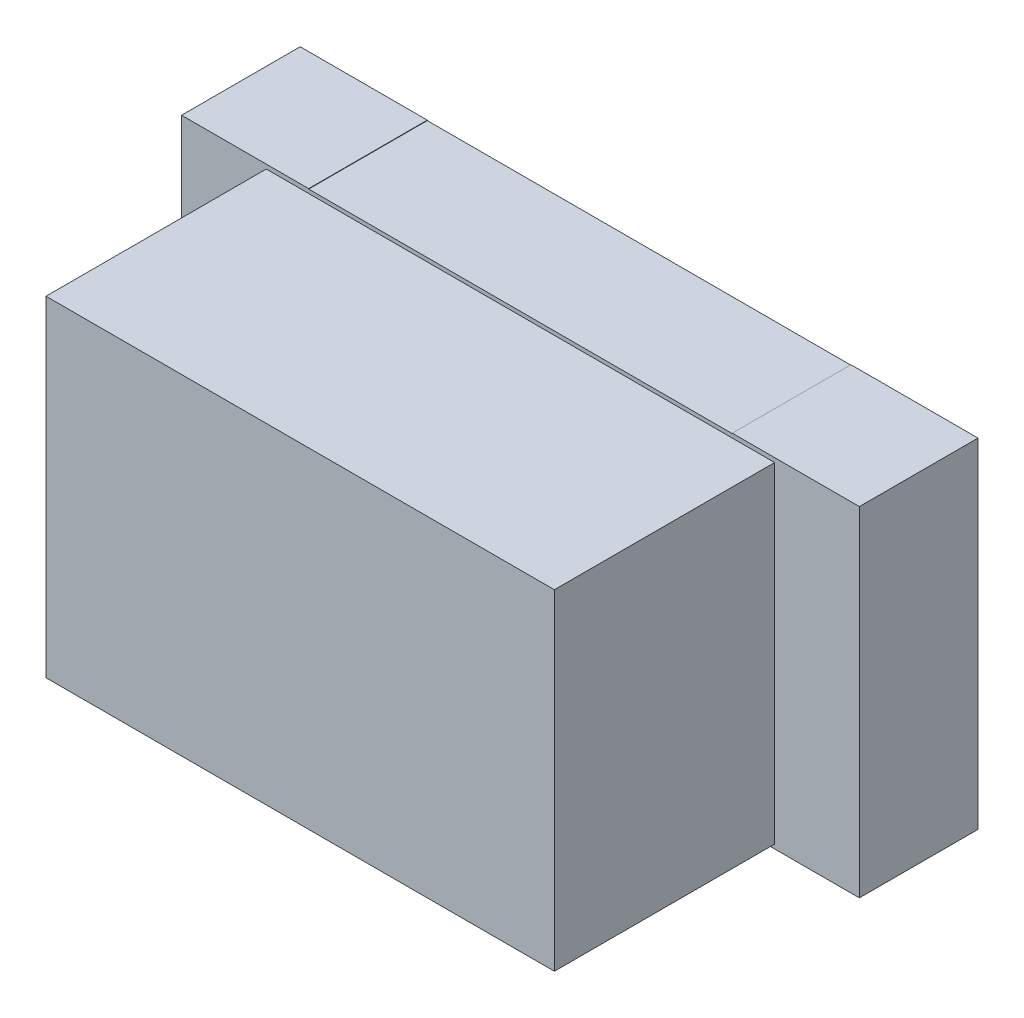
ISO-10303-21;
HEADER;
FILE_DESCRIPTION(('STEP AP214'),'2;1');
FILE_NAME('part.step','',(''),(''),'','','');
FILE_SCHEMA(('AUTOMOTIVE_DESIGN { 1 0 10303 214 1 1 1 1 }'));
ENDSEC;
DATA;
#1=APPLICATION_CONTEXT('core data for automotive mechanical design processes');
#2=APPLICATION_PROTOCOL_DEFINITION('international standard','automotive_design',2000,#1);
#3=PRODUCT_CONTEXT('',#1,'mechanical');
#4=PRODUCT('Part','Part','',(#3));
#5=PRODUCT_RELATED_PRODUCT_CATEGORY('part','',(#4));
#6=PRODUCT_DEFINITION_FORMATION('','',#4);
#7=PRODUCT_DEFINITION_CONTEXT('part definition',#1,'design');
#8=PRODUCT_DEFINITION('design','',#6,#7);
#9=PRODUCT_DEFINITION_SHAPE('','',#8);
#10=(LENGTH_UNIT() NAMED_UNIT(*) SI_UNIT(.MILLI.,.METRE.));
#11=(NAMED_UNIT(*) PLANE_ANGLE_UNIT() SI_UNIT($,.RADIAN.));
#12=(NAMED_UNIT(*) SI_UNIT($,.STERADIAN.) SOLID_ANGLE_UNIT());
#13=UNCERTAINTY_MEASURE_WITH_UNIT(LENGTH_MEASURE(1.E-05),#10,'distance_accuracy_value','');
#14=(GEOMETRIC_REPRESENTATION_CONTEXT(3) GLOBAL_UNCERTAINTY_ASSIGNED_CONTEXT((#13)) GLOBAL_UNIT_ASSIGNED_CONTEXT((#10,
#11,#12)) REPRESENTATION_CONTEXT('',''));
#15=CARTESIAN_POINT('',(0.,0.,0.));
#16=DIRECTION('',(0.,0.,1.));
#17=DIRECTION('',(1.,0.,0.));
#18=AXIS2_PLACEMENT_3D('',#15,#16,#17);
#19=CARTESIAN_POINT('',(0.,0.,0.));
#20=DIRECTION('',(0.,0.,1.));
#21=DIRECTION('',(1.,0.,0.));
#22=AXIS2_PLACEMENT_3D('',#19,#20,#21);
#23=PLANE('',#22);
#24=DIRECTION('',(0.,1.,0.));
#25=VECTOR('',#24,1.);
#26=CARTESIAN_POINT('',(-0.5,0.,0.));
#27=LINE('',#26,#25);
#28=CARTESIAN_POINT('',(-0.5,0.4,0.));
#29=VERTEX_POINT('',#28);
#30=CARTESIAN_POINT('',(-0.5,0.399,0.));
#31=VERTEX_POINT('',#30);
#32=EDGE_CURVE('E211',#29,#31,#27,.F.);
#33=ORIENTED_EDGE('',*,*,#32,.T.);
#34=DIRECTION('',(1.,0.,0.));
#35=VECTOR('',#34,1.);
#36=CARTESIAN_POINT('',(0.5,0.399,0.));
#37=LINE('',#36,#35);
#38=CARTESIAN_POINT('',(0.5,0.399,0.));
#39=VERTEX_POINT('',#38);
#40=EDGE_CURVE('E177',#31,#39,#37,.T.);
#41=ORIENTED_EDGE('',*,*,#40,.T.);
#42=DIRECTION('',(0.,1.,0.));
#43=VECTOR('',#42,1.);
#44=CARTESIAN_POINT('',(0.5,0.,0.));
#45=LINE('',#44,#43);
#46=CARTESIAN_POINT('',(0.5,0.4,0.));
#47=VERTEX_POINT('',#46);
#48=EDGE_CURVE('E185',#39,#47,#45,.T.);
#49=ORIENTED_EDGE('',*,*,#48,.T.);
#50=DIRECTION('',(1.,0.,0.));
#51=VECTOR('',#50,1.);
#52=CARTESIAN_POINT('',(-0.8,0.4,0.));
#53=LINE('',#52,#51);
#54=CARTESIAN_POINT('',(0.8,0.4,0.));
#55=VERTEX_POINT('',#54);
#56=EDGE_CURVE('E183',#47,#55,#53,.T.);
#57=ORIENTED_EDGE('',*,*,#56,.T.);
#58=DIRECTION('',(0.,-1.,0.));
#59=VECTOR('',#58,1.);
#60=CARTESIAN_POINT('',(0.8,0.4,0.));
#61=LINE('',#60,#59);
#62=CARTESIAN_POINT('',(0.8,-0.4,0.));
#63=VERTEX_POINT('',#62);
#64=EDGE_CURVE('E132',#55,#63,#61,.T.);
#65=ORIENTED_EDGE('',*,*,#64,.T.);
#66=DIRECTION('',(1.,0.,0.));
#67=VECTOR('',#66,1.);
#68=CARTESIAN_POINT('',(-0.8,-0.4,0.));
#69=LINE('',#68,#67);
#70=CARTESIAN_POINT('',(0.5,-0.4,0.));
#71=VERTEX_POINT('',#70);
#72=EDGE_CURVE('E127',#63,#71,#69,.F.);
#73=ORIENTED_EDGE('',*,*,#72,.T.);
#74=DIRECTION('',(0.,1.,0.));
#75=VECTOR('',#74,1.);
#76=CARTESIAN_POINT('',(0.5,0.,0.));
#77=LINE('',#76,#75);
#78=CARTESIAN_POINT('',(0.5,-0.399,0.));
#79=VERTEX_POINT('',#78);
#80=EDGE_CURVE('E20',#71,#79,#77,.T.);
#81=ORIENTED_EDGE('',*,*,#80,.T.);
#82=DIRECTION('',(1.,0.,0.));
#83=VECTOR('',#82,1.);
#84=CARTESIAN_POINT('',(0.5,-0.399,0.));
#85=LINE('',#84,#83);
#86=CARTESIAN_POINT('',(-0.5,-0.399,0.));
#87=VERTEX_POINT('',#86);
#88=EDGE_CURVE('E154',#79,#87,#85,.F.);
#89=ORIENTED_EDGE('',*,*,#88,.T.);
#90=DIRECTION('',(0.,1.,0.));
#91=VECTOR('',#90,1.);
#92=CARTESIAN_POINT('',(-0.5,0.,0.));
#93=LINE('',#92,#91);
#94=CARTESIAN_POINT('',(-0.5,-0.4,0.));
#95=VERTEX_POINT('',#94);
#96=EDGE_CURVE('E162',#87,#95,#93,.F.);
#97=ORIENTED_EDGE('',*,*,#96,.T.);
#98=DIRECTION('',(1.,0.,0.));
#99=VECTOR('',#98,1.);
#100=CARTESIAN_POINT('',(-0.8,-0.4,0.));
#101=LINE('',#100,#99);
#102=CARTESIAN_POINT('',(-0.8,-0.4,0.));
#103=VERTEX_POINT('',#102);
#104=EDGE_CURVE('E159',#95,#103,#101,.F.);
#105=ORIENTED_EDGE('',*,*,#104,.T.);
#106=DIRECTION('',(0.,1.,0.));
#107=VECTOR('',#106,1.);
#108=CARTESIAN_POINT('',(-0.8,0.4,0.));
#109=LINE('',#108,#107);
#110=CARTESIAN_POINT('',(-0.8,0.4,0.));
#111=VERTEX_POINT('',#110);
#112=EDGE_CURVE('E166',#103,#111,#109,.T.);
#113=ORIENTED_EDGE('',*,*,#112,.T.);
#114=DIRECTION('',(1.,0.,0.));
#115=VECTOR('',#114,1.);
#116=CARTESIAN_POINT('',(-0.8,0.4,0.));
#117=LINE('',#116,#115);
#118=EDGE_CURVE('E172',#111,#29,#117,.T.);
#119=ORIENTED_EDGE('',*,*,#118,.T.);
#120=EDGE_LOOP('',(#33,#41,#49,#57,#65,#73,#81,#89,#97,#105,#113,#119));
#121=FACE_BOUND('',#120,.T.);
#122=ADVANCED_FACE('F17',(#121),#23,.F.);
#123=CARTESIAN_POINT('',(0.5,-0.399,1.2800005));
#124=DIRECTION('',(1.,-4.336808689941E-13,0.));
#125=DIRECTION('',(4.336808689941E-13,1.,0.));
#126=AXIS2_PLACEMENT_3D('',#123,#124,#125);
#127=PLANE('',#126);
#128=ORIENTED_EDGE('',*,*,#80,.F.);
#129=DIRECTION('',(0.,0.,1.));
#130=VECTOR('',#129,1.);
#131=CARTESIAN_POINT('',(0.5,-0.4,0.8));
#132=LINE('',#131,#130);
#133=CARTESIAN_POINT('',(0.5,-0.4,0.28));
#134=VERTEX_POINT('',#133);
#135=EDGE_CURVE('E136',#71,#134,#132,.T.);
#136=ORIENTED_EDGE('',*,*,#135,.T.);
#137=DIRECTION('',(0.,1.,0.));
#138=VECTOR('',#137,1.);
#139=CARTESIAN_POINT('',(0.5,0.,0.28));
#140=LINE('',#139,#138);
#141=CARTESIAN_POINT('',(0.5,-0.399,0.28));
#142=VERTEX_POINT('',#141);
#143=EDGE_CURVE('E207',#142,#134,#140,.F.);
#144=ORIENTED_EDGE('',*,*,#143,.F.);
#145=DIRECTION('',(0.,0.,1.));
#146=VECTOR('',#145,1.);
#147=CARTESIAN_POINT('',(0.5,-0.399,1.2800005));
#148=LINE('',#147,#146);
#149=EDGE_CURVE('E142',#142,#79,#148,.F.);
#150=ORIENTED_EDGE('',*,*,#149,.T.);
#151=EDGE_LOOP('',(#128,#136,#144,#150));
#152=FACE_BOUND('',#151,.T.);
#153=ADVANCED_FACE('F139',(#152),#127,.F.);
#154=CARTESIAN_POINT('',(-0.8,-0.4,0.8));
#155=DIRECTION('',(0.,1.,0.));
#156=DIRECTION('',(0.,0.,1.));
#157=AXIS2_PLACEMENT_3D('',#154,#155,#156);
#158=PLANE('',#157);
#159=ORIENTED_EDGE('',*,*,#135,.F.);
#160=ORIENTED_EDGE('',*,*,#72,.F.);
#161=DIRECTION('',(0.,0.,1.));
#162=VECTOR('',#161,1.);
#163=CARTESIAN_POINT('',(0.8,-0.4,0.8));
#164=LINE('',#163,#162);
#165=CARTESIAN_POINT('',(0.8,-0.4,0.28));
#166=VERTEX_POINT('',#165);
#167=EDGE_CURVE('E148',#63,#166,#164,.T.);
#168=ORIENTED_EDGE('',*,*,#167,.T.);
#169=DIRECTION('',(1.,0.,0.));
#170=VECTOR('',#169,1.);
#171=CARTESIAN_POINT('',(0.,-0.4,0.28));
#172=LINE('',#171,#170);
#173=EDGE_CURVE('E145',#134,#166,#172,.T.);
#174=ORIENTED_EDGE('',*,*,#173,.F.);
#175=EDGE_LOOP('',(#159,#160,#168,#174));
#176=FACE_BOUND('',#175,.T.);
#177=ADVANCED_FACE('F143',(#176),#158,.F.);
#178=CARTESIAN_POINT('',(0.8,0.4,0.8));
#179=DIRECTION('',(-1.,0.,0.));
#180=DIRECTION('',(0.,-1.,0.));
#181=AXIS2_PLACEMENT_3D('',#178,#179,#180);
#182=PLANE('',#181);
#183=ORIENTED_EDGE('',*,*,#167,.F.);
#184=ORIENTED_EDGE('',*,*,#64,.F.);
#185=DIRECTION('',(0.,0.,-1.));
#186=VECTOR('',#185,1.);
#187=CARTESIAN_POINT('',(0.8,0.4,0.8));
#188=LINE('',#187,#186);
#189=CARTESIAN_POINT('',(0.8,0.4,0.28));
#190=VERTEX_POINT('',#189);
#191=EDGE_CURVE('E186',#55,#190,#188,.F.);
#192=ORIENTED_EDGE('',*,*,#191,.T.);
#193=DIRECTION('',(0.,1.,0.));
#194=VECTOR('',#193,1.);
#195=CARTESIAN_POINT('',(0.8,0.,0.28));
#196=LINE('',#195,#194);
#197=EDGE_CURVE('E225',#166,#190,#196,.T.);
#198=ORIENTED_EDGE('',*,*,#197,.F.);
#199=EDGE_LOOP('',(#183,#184,#192,#198));
#200=FACE_BOUND('',#199,.T.);
#201=ADVANCED_FACE('F231',(#200),#182,.F.);
#202=CARTESIAN_POINT('',(-0.8,0.4,0.8));
#203=DIRECTION('',(0.,-1.,0.));
#204=DIRECTION('',(0.,0.,-1.));
#205=AXIS2_PLACEMENT_3D('',#202,#203,#204);
#206=PLANE('',#205);
#207=DIRECTION('',(0.,0.,-1.));
#208=VECTOR('',#207,1.);
#209=CARTESIAN_POINT('',(0.5,0.4,1.2800005));
#210=LINE('',#209,#208);
#211=CARTESIAN_POINT('',(0.5,0.4,0.28));
#212=VERTEX_POINT('',#211);
#213=EDGE_CURVE('E180',#47,#212,#210,.F.);
#214=ORIENTED_EDGE('',*,*,#213,.T.);
#215=DIRECTION('',(1.,0.,0.));
#216=VECTOR('',#215,1.);
#217=CARTESIAN_POINT('',(0.,0.4,0.28));
#218=LINE('',#217,#216);
#219=EDGE_CURVE('E206',#190,#212,#218,.F.);
#220=ORIENTED_EDGE('',*,*,#219,.F.);
#221=ORIENTED_EDGE('',*,*,#191,.F.);
#222=ORIENTED_EDGE('',*,*,#56,.F.);
#223=EDGE_LOOP('',(#214,#220,#221,#222));
#224=FACE_BOUND('',#223,.T.);
#225=ADVANCED_FACE('F275',(#224),#206,.F.);
#226=CARTESIAN_POINT('',(0.5,0.4,1.2800005));
#227=DIRECTION('',(1.,0.,0.));
#228=DIRECTION('',(0.,0.,-1.));
#229=AXIS2_PLACEMENT_3D('',#226,#227,#228);
#230=PLANE('',#229);
#231=ORIENTED_EDGE('',*,*,#48,.F.);
#232=DIRECTION('',(0.,0.,1.));
#233=VECTOR('',#232,1.);
#234=CARTESIAN_POINT('',(0.5,0.399,1.2800005));
#235=LINE('',#234,#233);
#236=CARTESIAN_POINT('',(0.5,0.399,0.28));
#237=VERTEX_POINT('',#236);
#238=EDGE_CURVE('E179',#39,#237,#235,.T.);
#239=ORIENTED_EDGE('',*,*,#238,.T.);
#240=DIRECTION('',(0.,1.,0.));
#241=VECTOR('',#240,1.);
#242=CARTESIAN_POINT('',(0.5,0.,0.28));
#243=LINE('',#242,#241);
#244=EDGE_CURVE('E203',#212,#237,#243,.F.);
#245=ORIENTED_EDGE('',*,*,#244,.F.);
#246=ORIENTED_EDGE('',*,*,#213,.F.);
#247=EDGE_LOOP('',(#231,#239,#245,#246));
#248=FACE_BOUND('',#247,.T.);
#249=ADVANCED_FACE('F277',(#248),#230,.F.);
#250=CARTESIAN_POINT('',(0.5,0.399,1.2800005));
#251=DIRECTION('',(0.,-1.,0.));
#252=DIRECTION('',(1.,0.,0.));
#253=AXIS2_PLACEMENT_3D('',#250,#251,#252);
#254=PLANE('',#253);
#255=ORIENTED_EDGE('',*,*,#40,.F.);
#256=DIRECTION('',(0.,0.,1.));
#257=VECTOR('',#256,1.);
#258=CARTESIAN_POINT('',(-0.5,0.399,1.2800005));
#259=LINE('',#258,#257);
#260=CARTESIAN_POINT('',(-0.5,0.399,0.28));
#261=VERTEX_POINT('',#260);
#262=EDGE_CURVE('E174',#31,#261,#259,.T.);
#263=ORIENTED_EDGE('',*,*,#262,.T.);
#264=DIRECTION('',(1.,0.,0.));
#265=VECTOR('',#264,1.);
#266=CARTESIAN_POINT('',(0.,0.399,0.28));
#267=LINE('',#266,#265);
#268=EDGE_CURVE('E202',#237,#261,#267,.F.);
#269=ORIENTED_EDGE('',*,*,#268,.F.);
#270=ORIENTED_EDGE('',*,*,#238,.F.);
#271=EDGE_LOOP('',(#255,#263,#269,#270));
#272=FACE_BOUND('',#271,.T.);
#273=ADVANCED_FACE('F262',(#272),#254,.F.);
#274=CARTESIAN_POINT('',(-0.5,0.4,1.2800005));
#275=DIRECTION('',(-1.,0.,0.));
#276=DIRECTION('',(0.,0.,1.));
#277=AXIS2_PLACEMENT_3D('',#274,#275,#276);
#278=PLANE('',#277);
#279=ORIENTED_EDGE('',*,*,#32,.F.);
#280=DIRECTION('',(0.,0.,-1.));
#281=VECTOR('',#280,1.);
#282=CARTESIAN_POINT('',(-0.5,0.4,0.8));
#283=LINE('',#282,#281);
#284=CARTESIAN_POINT('',(-0.5,0.4,0.28));
#285=VERTEX_POINT('',#284);
#286=EDGE_CURVE('E169',#29,#285,#283,.F.);
#287=ORIENTED_EDGE('',*,*,#286,.T.);
#288=DIRECTION('',(0.,1.,0.));
#289=VECTOR('',#288,1.);
#290=CARTESIAN_POINT('',(-0.5,0.,0.28));
#291=LINE('',#290,#289);
#292=EDGE_CURVE('E198',#261,#285,#291,.T.);
#293=ORIENTED_EDGE('',*,*,#292,.F.);
#294=ORIENTED_EDGE('',*,*,#262,.F.);
#295=EDGE_LOOP('',(#279,#287,#293,#294));
#296=FACE_BOUND('',#295,.T.);
#297=ADVANCED_FACE('F267',(#296),#278,.F.);
#298=CARTESIAN_POINT('',(-0.8,0.4,0.8));
#299=DIRECTION('',(0.,-1.,0.));
#300=DIRECTION('',(0.,0.,-1.));
#301=AXIS2_PLACEMENT_3D('',#298,#299,#300);
#302=PLANE('',#301);
#303=ORIENTED_EDGE('',*,*,#286,.F.);
#304=ORIENTED_EDGE('',*,*,#118,.F.);
#305=DIRECTION('',(0.,0.,-1.));
#306=VECTOR('',#305,1.);
#307=CARTESIAN_POINT('',(-0.8,0.4,0.8));
#308=LINE('',#307,#306);
#309=CARTESIAN_POINT('',(-0.8,0.4,0.28));
#310=VERTEX_POINT('',#309);
#311=EDGE_CURVE('E168',#111,#310,#308,.F.);
#312=ORIENTED_EDGE('',*,*,#311,.T.);
#313=DIRECTION('',(1.,0.,0.));
#314=VECTOR('',#313,1.);
#315=CARTESIAN_POINT('',(0.,0.4,0.28));
#316=LINE('',#315,#314);
#317=EDGE_CURVE('E201',#285,#310,#316,.F.);
#318=ORIENTED_EDGE('',*,*,#317,.F.);
#319=EDGE_LOOP('',(#303,#304,#312,#318));
#320=FACE_BOUND('',#319,.T.);
#321=ADVANCED_FACE('F328',(#320),#302,.F.);
#322=CARTESIAN_POINT('',(-0.8,0.4,0.8));
#323=DIRECTION('',(1.,0.,0.));
#324=DIRECTION('',(0.,0.,-1.));
#325=AXIS2_PLACEMENT_3D('',#322,#323,#324);
#326=PLANE('',#325);
#327=ORIENTED_EDGE('',*,*,#311,.F.);
#328=ORIENTED_EDGE('',*,*,#112,.F.);
#329=DIRECTION('',(0.,0.,1.));
#330=VECTOR('',#329,1.);
#331=CARTESIAN_POINT('',(-0.8,-0.4,0.8));
#332=LINE('',#331,#330);
#333=CARTESIAN_POINT('',(-0.8,-0.4,0.28));
#334=VERTEX_POINT('',#333);
#335=EDGE_CURVE('E163',#103,#334,#332,.T.);
#336=ORIENTED_EDGE('',*,*,#335,.T.);
#337=DIRECTION('',(0.,1.,0.));
#338=VECTOR('',#337,1.);
#339=CARTESIAN_POINT('',(-0.8,0.,0.28));
#340=LINE('',#339,#338);
#341=EDGE_CURVE('E250',#310,#334,#340,.F.);
#342=ORIENTED_EDGE('',*,*,#341,.F.);
#343=EDGE_LOOP('',(#327,#328,#336,#342));
#344=FACE_BOUND('',#343,.T.);
#345=ADVANCED_FACE('F324',(#344),#326,.F.);
#346=CARTESIAN_POINT('',(-0.8,-0.4,0.8));
#347=DIRECTION('',(0.,1.,0.));
#348=DIRECTION('',(0.,0.,1.));
#349=AXIS2_PLACEMENT_3D('',#346,#347,#348);
#350=PLANE('',#349);
#351=DIRECTION('',(0.,0.,1.));
#352=VECTOR('',#351,1.);
#353=CARTESIAN_POINT('',(-0.5,-0.4,1.2800005));
#354=LINE('',#353,#352);
#355=CARTESIAN_POINT('',(-0.5,-0.4,0.28));
#356=VERTEX_POINT('',#355);
#357=EDGE_CURVE('E210',#95,#356,#354,.T.);
#358=ORIENTED_EDGE('',*,*,#357,.T.);
#359=DIRECTION('',(1.,0.,0.));
#360=VECTOR('',#359,1.);
#361=CARTESIAN_POINT('',(0.,-0.4,0.28));
#362=LINE('',#361,#360);
#363=EDGE_CURVE('E197',#334,#356,#362,.T.);
#364=ORIENTED_EDGE('',*,*,#363,.F.);
#365=ORIENTED_EDGE('',*,*,#335,.F.);
#366=ORIENTED_EDGE('',*,*,#104,.F.);
#367=EDGE_LOOP('',(#358,#364,#365,#366));
#368=FACE_BOUND('',#367,.T.);
#369=ADVANCED_FACE('F320',(#368),#350,.F.);
#370=CARTESIAN_POINT('',(-0.5,-0.399,1.2800005));
#371=DIRECTION('',(-1.,0.,0.));
#372=DIRECTION('',(0.,0.,1.));
#373=AXIS2_PLACEMENT_3D('',#370,#371,#372);
#374=PLANE('',#373);
#375=ORIENTED_EDGE('',*,*,#96,.F.);
#376=DIRECTION('',(0.,0.,1.));
#377=VECTOR('',#376,1.);
#378=CARTESIAN_POINT('',(-0.5,-0.399,1.2800005));
#379=LINE('',#378,#377);
#380=CARTESIAN_POINT('',(-0.5,-0.399,0.28));
#381=VERTEX_POINT('',#380);
#382=EDGE_CURVE('E156',#87,#381,#379,.T.);
#383=ORIENTED_EDGE('',*,*,#382,.T.);
#384=DIRECTION('',(0.,1.,0.));
#385=VECTOR('',#384,1.);
#386=CARTESIAN_POINT('',(-0.5,0.,0.28));
#387=LINE('',#386,#385);
#388=EDGE_CURVE('E193',#356,#381,#387,.T.);
#389=ORIENTED_EDGE('',*,*,#388,.F.);
#390=ORIENTED_EDGE('',*,*,#357,.F.);
#391=EDGE_LOOP('',(#375,#383,#389,#390));
#392=FACE_BOUND('',#391,.T.);
#393=ADVANCED_FACE('F316',(#392),#374,.F.);
#394=CARTESIAN_POINT('',(0.5,-0.399,1.2800005));
#395=DIRECTION('',(0.,1.,0.));
#396=DIRECTION('',(0.,0.,1.));
#397=AXIS2_PLACEMENT_3D('',#394,#395,#396);
#398=PLANE('',#397);
#399=ORIENTED_EDGE('',*,*,#88,.F.);
#400=ORIENTED_EDGE('',*,*,#149,.F.);
#401=DIRECTION('',(1.,0.,0.));
#402=VECTOR('',#401,1.);
#403=CARTESIAN_POINT('',(0.,-0.399,0.28));
#404=LINE('',#403,#402);
#405=EDGE_CURVE('E196',#381,#142,#404,.T.);
#406=ORIENTED_EDGE('',*,*,#405,.F.);
#407=ORIENTED_EDGE('',*,*,#382,.F.);
#408=EDGE_LOOP('',(#399,#400,#406,#407));
#409=FACE_BOUND('',#408,.T.);
#410=ADVANCED_FACE('F312',(#409),#398,.F.);
#411=CARTESIAN_POINT('',(0.,0.,0.28));
#412=DIRECTION('',(0.,0.,1.));
#413=DIRECTION('',(1.,0.,0.));
#414=AXIS2_PLACEMENT_3D('',#411,#412,#413);
#415=PLANE('',#414);
#416=DIRECTION('',(1.,0.,0.));
#417=VECTOR('',#416,1.);
#418=CARTESIAN_POINT('',(-0.6,-0.39,0.28));
#419=LINE('',#418,#417);
#420=CARTESIAN_POINT('',(0.6,-0.39,0.28));
#421=VERTEX_POINT('',#420);
#422=CARTESIAN_POINT('',(-0.6,-0.39,0.28));
#423=VERTEX_POINT('',#422);
#424=EDGE_CURVE('E545',#421,#423,#419,.F.);
#425=ORIENTED_EDGE('',*,*,#424,.T.);
#426=DIRECTION('',(0.,1.,0.));
#427=VECTOR('',#426,1.);
#428=CARTESIAN_POINT('',(-0.6,-0.39,0.28));
#429=LINE('',#428,#427);
#430=CARTESIAN_POINT('',(-0.6,0.39,0.28));
#431=VERTEX_POINT('',#430);
#432=EDGE_CURVE('E540',#423,#431,#429,.T.);
#433=ORIENTED_EDGE('',*,*,#432,.T.);
#434=DIRECTION('',(1.,0.,0.));
#435=VECTOR('',#434,1.);
#436=CARTESIAN_POINT('',(0.6,0.39,0.28));
#437=LINE('',#436,#435);
#438=CARTESIAN_POINT('',(0.6,0.39,0.28));
#439=VERTEX_POINT('',#438);
#440=EDGE_CURVE('E536',#431,#439,#437,.T.);
#441=ORIENTED_EDGE('',*,*,#440,.T.);
#442=DIRECTION('',(0.,-1.,0.));
#443=VECTOR('',#442,1.);
#444=CARTESIAN_POINT('',(0.6,0.39,0.28));
#445=LINE('',#444,#443);
#446=EDGE_CURVE('E552',#439,#421,#445,.T.);
#447=ORIENTED_EDGE('',*,*,#446,.T.);
#448=EDGE_LOOP('',(#425,#433,#441,#447));
#449=FACE_BOUND('',#448,.T.);
#450=ORIENTED_EDGE('',*,*,#388,.T.);
#451=ORIENTED_EDGE('',*,*,#405,.T.);
#452=ORIENTED_EDGE('',*,*,#143,.T.);
#453=ORIENTED_EDGE('',*,*,#173,.T.);
#454=ORIENTED_EDGE('',*,*,#197,.T.);
#455=ORIENTED_EDGE('',*,*,#219,.T.);
#456=ORIENTED_EDGE('',*,*,#244,.T.);
#457=ORIENTED_EDGE('',*,*,#268,.T.);
#458=ORIENTED_EDGE('',*,*,#292,.T.);
#459=ORIENTED_EDGE('',*,*,#317,.T.);
#460=ORIENTED_EDGE('',*,*,#341,.T.);
#461=ORIENTED_EDGE('',*,*,#363,.T.);
#462=EDGE_LOOP('',(#450,#451,#452,#453,#454,#455,#456,#457,#458,#459,#460,#461));
#463=FACE_BOUND('',#462,.T.);
#464=ADVANCED_FACE('F235',(#449,#463),#415,.T.);
#465=CARTESIAN_POINT('',(0.6,0.39,0.8));
#466=DIRECTION('',(0.,-1.,0.));
#467=DIRECTION('',(1.,0.,0.));
#468=AXIS2_PLACEMENT_3D('',#465,#466,#467);
#469=PLANE('',#468);
#470=DIRECTION('',(0.,0.,1.));
#471=VECTOR('',#470,1.);
#472=CARTESIAN_POINT('',(-0.6,0.39,0.8));
#473=LINE('',#472,#471);
#474=CARTESIAN_POINT('',(-0.6,0.39,0.8));
#475=VERTEX_POINT('',#474);
#476=EDGE_CURVE('E538',#431,#475,#473,.T.);
#477=ORIENTED_EDGE('',*,*,#476,.T.);
#478=DIRECTION('',(1.,0.,0.));
#479=VECTOR('',#478,1.);
#480=CARTESIAN_POINT('',(0.,0.39,0.8));
#481=LINE('',#480,#479);
#482=CARTESIAN_POINT('',(0.6,0.39,0.8));
#483=VERTEX_POINT('',#482);
#484=EDGE_CURVE('E555',#483,#475,#481,.F.);
#485=ORIENTED_EDGE('',*,*,#484,.F.);
#486=DIRECTION('',(0.,0.,1.));
#487=VECTOR('',#486,1.);
#488=CARTESIAN_POINT('',(0.6,0.39,0.8));
#489=LINE('',#488,#487);
#490=EDGE_CURVE('E549',#483,#439,#489,.F.);
#491=ORIENTED_EDGE('',*,*,#490,.T.);
#492=ORIENTED_EDGE('',*,*,#440,.F.);
#493=EDGE_LOOP('',(#477,#485,#491,#492));
#494=FACE_BOUND('',#493,.T.);
#495=ADVANCED_FACE('F305',(#494),#469,.F.);
#496=CARTESIAN_POINT('',(-0.6,-0.39,0.8));
#497=DIRECTION('',(1.,0.,0.));
#498=DIRECTION('',(0.,1.,0.));
#499=AXIS2_PLACEMENT_3D('',#496,#497,#498);
#500=PLANE('',#499);
#501=DIRECTION('',(0.,0.,1.));
#502=VECTOR('',#501,1.);
#503=CARTESIAN_POINT('',(-0.6,-0.39,0.8));
#504=LINE('',#503,#502);
#505=CARTESIAN_POINT('',(-0.6,-0.39,0.8));
#506=VERTEX_POINT('',#505);
#507=EDGE_CURVE('E543',#423,#506,#504,.T.);
#508=ORIENTED_EDGE('',*,*,#507,.T.);
#509=DIRECTION('',(0.,1.,0.));
#510=VECTOR('',#509,1.);
#511=CARTESIAN_POINT('',(-0.6,0.,0.8));
#512=LINE('',#511,#510);
#513=EDGE_CURVE('E558',#475,#506,#512,.F.);
#514=ORIENTED_EDGE('',*,*,#513,.F.);
#515=ORIENTED_EDGE('',*,*,#476,.F.);
#516=ORIENTED_EDGE('',*,*,#432,.F.);
#517=EDGE_LOOP('',(#508,#514,#515,#516));
#518=FACE_BOUND('',#517,.T.);
#519=ADVANCED_FACE('F302',(#518),#500,.F.);
#520=CARTESIAN_POINT('',(-0.6,-0.39,0.8));
#521=DIRECTION('',(0.,1.,0.));
#522=DIRECTION('',(0.,0.,1.));
#523=AXIS2_PLACEMENT_3D('',#520,#521,#522);
#524=PLANE('',#523);
#525=DIRECTION('',(0.,0.,1.));
#526=VECTOR('',#525,1.);
#527=CARTESIAN_POINT('',(0.6,-0.39,0.8));
#528=LINE('',#527,#526);
#529=CARTESIAN_POINT('',(0.6,-0.39,0.8));
#530=VERTEX_POINT('',#529);
#531=EDGE_CURVE('E35',#421,#530,#528,.T.);
#532=ORIENTED_EDGE('',*,*,#531,.T.);
#533=DIRECTION('',(1.,0.,0.));
#534=VECTOR('',#533,1.);
#535=CARTESIAN_POINT('',(0.,-0.39,0.8));
#536=LINE('',#535,#534);
#537=EDGE_CURVE('E26',#506,#530,#536,.T.);
#538=ORIENTED_EDGE('',*,*,#537,.F.);
#539=ORIENTED_EDGE('',*,*,#507,.F.);
#540=ORIENTED_EDGE('',*,*,#424,.F.);
#541=EDGE_LOOP('',(#532,#538,#539,#540));
#542=FACE_BOUND('',#541,.T.);
#543=ADVANCED_FACE('F295',(#542),#524,.F.);
#544=CARTESIAN_POINT('',(0.6,0.39,0.8));
#545=DIRECTION('',(-1.,0.,0.));
#546=DIRECTION('',(0.,-1.,0.));
#547=AXIS2_PLACEMENT_3D('',#544,#545,#546);
#548=PLANE('',#547);
#549=ORIENTED_EDGE('',*,*,#490,.F.);
#550=DIRECTION('',(0.,1.,0.));
#551=VECTOR('',#550,1.);
#552=CARTESIAN_POINT('',(0.6,0.,0.8));
#553=LINE('',#552,#551);
#554=EDGE_CURVE('E11',#530,#483,#553,.T.);
#555=ORIENTED_EDGE('',*,*,#554,.F.);
#556=ORIENTED_EDGE('',*,*,#531,.F.);
#557=ORIENTED_EDGE('',*,*,#446,.F.);
#558=EDGE_LOOP('',(#549,#555,#556,#557));
#559=FACE_BOUND('',#558,.T.);
#560=ADVANCED_FACE('F289',(#559),#548,.F.);
#561=CARTESIAN_POINT('',(0.,0.,0.8));
#562=DIRECTION('',(0.,0.,1.));
#563=DIRECTION('',(1.,0.,0.));
#564=AXIS2_PLACEMENT_3D('',#561,#562,#563);
#565=PLANE('',#564);
#566=ORIENTED_EDGE('',*,*,#537,.T.);
#567=ORIENTED_EDGE('',*,*,#554,.T.);
#568=ORIENTED_EDGE('',*,*,#484,.T.);
#569=ORIENTED_EDGE('',*,*,#513,.T.);
#570=EDGE_LOOP('',(#566,#567,#568,#569));
#571=FACE_BOUND('',#570,.T.);
#572=ADVANCED_FACE('F287',(#571),#565,.T.);
#573=CLOSED_SHELL('',(#122,#153,#177,#201,#225,#249,#273,#297,#321,#345,#369,#393,#410,#464,
#495,#519,#543,#560,#572));
#574=MANIFOLD_SOLID_BREP('B1',#573);
#575=ADVANCED_BREP_SHAPE_REPRESENTATION('',(#18,#574),#14);
#576=SHAPE_DEFINITION_REPRESENTATION(#9,#575);
ENDSEC;
END-ISO-10303-21;
